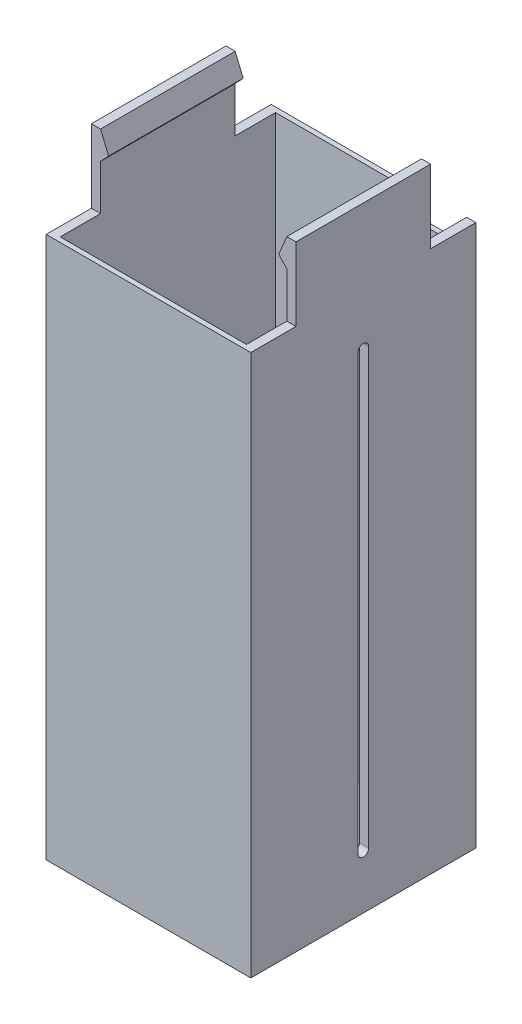
ISO-10303-21;
HEADER;
FILE_DESCRIPTION(('STEP AP214'),'2;1');
FILE_NAME('part.step','',(''),(''),'','','');
FILE_SCHEMA(('AUTOMOTIVE_DESIGN { 1 0 10303 214 1 1 1 1 }'));
ENDSEC;
DATA;
#1=APPLICATION_CONTEXT('core data for automotive mechanical design processes');
#2=APPLICATION_PROTOCOL_DEFINITION('international standard','automotive_design',2000,#1);
#3=PRODUCT_CONTEXT('',#1,'mechanical');
#4=PRODUCT('Part','Part','',(#3));
#5=PRODUCT_RELATED_PRODUCT_CATEGORY('part','',(#4));
#6=PRODUCT_DEFINITION_FORMATION('','',#4);
#7=PRODUCT_DEFINITION_CONTEXT('part definition',#1,'design');
#8=PRODUCT_DEFINITION('design','',#6,#7);
#9=PRODUCT_DEFINITION_SHAPE('','',#8);
#10=(LENGTH_UNIT() NAMED_UNIT(*) SI_UNIT(.MILLI.,.METRE.));
#11=(NAMED_UNIT(*) PLANE_ANGLE_UNIT() SI_UNIT($,.RADIAN.));
#12=(NAMED_UNIT(*) SI_UNIT($,.STERADIAN.) SOLID_ANGLE_UNIT());
#13=UNCERTAINTY_MEASURE_WITH_UNIT(LENGTH_MEASURE(1.E-05),#10,'distance_accuracy_value','');
#14=(GEOMETRIC_REPRESENTATION_CONTEXT(3) GLOBAL_UNCERTAINTY_ASSIGNED_CONTEXT((#13)) GLOBAL_UNIT_ASSIGNED_CONTEXT((#10,
#11,#12)) REPRESENTATION_CONTEXT('',''));
#15=CARTESIAN_POINT('',(0.,0.,0.));
#16=DIRECTION('',(0.,0.,1.));
#17=DIRECTION('',(1.,0.,0.));
#18=AXIS2_PLACEMENT_3D('',#15,#16,#17);
#19=CARTESIAN_POINT('',(0.,100.,0.));
#20=DIRECTION('',(0.,1.,0.));
#21=DIRECTION('',(0.,0.,1.));
#22=AXIS2_PLACEMENT_3D('',#19,#20,#21);
#23=PLANE('',#22);
#24=DIRECTION('',(-1.,0.,0.));
#25=VECTOR('',#24,1.);
#26=CARTESIAN_POINT('',(-19.,100.,-20.9));
#27=LINE('',#26,#25);
#28=CARTESIAN_POINT('',(19.,100.,-20.9));
#29=VERTEX_POINT('',#28);
#30=CARTESIAN_POINT('',(17.3,100.,-20.9));
#31=VERTEX_POINT('',#30);
#32=EDGE_CURVE('E385',#29,#31,#27,.T.);
#33=ORIENTED_EDGE('',*,*,#32,.T.);
#34=DIRECTION('',(0.,0.,-1.));
#35=VECTOR('',#34,1.);
#36=CARTESIAN_POINT('',(17.3,100.,-20.));
#37=LINE('',#36,#35);
#38=CARTESIAN_POINT('',(17.3,100.,-12.5));
#39=VERTEX_POINT('',#38);
#40=EDGE_CURVE('E354',#39,#31,#37,.T.);
#41=ORIENTED_EDGE('',*,*,#40,.F.);
#42=DIRECTION('',(-1.,0.,0.));
#43=VECTOR('',#42,1.);
#44=CARTESIAN_POINT('',(17.3,100.,-12.5));
#45=LINE('',#44,#43);
#46=CARTESIAN_POINT('',(19.,100.,-12.5));
#47=VERTEX_POINT('',#46);
#48=EDGE_CURVE('E301',#47,#39,#45,.T.);
#49=ORIENTED_EDGE('',*,*,#48,.F.);
#50=DIRECTION('',(0.,0.,-1.));
#51=VECTOR('',#50,1.);
#52=CARTESIAN_POINT('',(19.,100.,-20.9));
#53=LINE('',#52,#51);
#54=EDGE_CURVE('E380',#47,#29,#53,.T.);
#55=ORIENTED_EDGE('',*,*,#54,.T.);
#56=EDGE_LOOP('',(#33,#41,#49,#55));
#57=FACE_BOUND('',#56,.T.);
#58=ADVANCED_FACE('F35',(#57),#23,.T.);
#59=CARTESIAN_POINT('',(19.,100.,20.9));
#60=VERTEX_POINT('',#59);
#61=CARTESIAN_POINT('',(19.,100.,12.5));
#62=VERTEX_POINT('',#61);
#63=EDGE_CURVE('E381',#60,#62,#53,.T.);
#64=ORIENTED_EDGE('',*,*,#63,.T.);
#65=DIRECTION('',(1.,0.,0.));
#66=VECTOR('',#65,1.);
#67=CARTESIAN_POINT('',(17.3,100.,12.5));
#68=LINE('',#67,#66);
#69=CARTESIAN_POINT('',(17.3,100.,12.5));
#70=VERTEX_POINT('',#69);
#71=EDGE_CURVE('E287',#70,#62,#68,.T.);
#72=ORIENTED_EDGE('',*,*,#71,.F.);
#73=CARTESIAN_POINT('',(17.3,100.,20.));
#74=VERTEX_POINT('',#73);
#75=EDGE_CURVE('E355',#74,#70,#37,.T.);
#76=ORIENTED_EDGE('',*,*,#75,.F.);
#77=DIRECTION('',(1.,0.,0.));
#78=VECTOR('',#77,1.);
#79=CARTESIAN_POINT('',(17.3,100.,20.));
#80=LINE('',#79,#78);
#81=CARTESIAN_POINT('',(-17.3,100.,20.));
#82=VERTEX_POINT('',#81);
#83=EDGE_CURVE('E351',#82,#74,#80,.T.);
#84=ORIENTED_EDGE('',*,*,#83,.F.);
#85=DIRECTION('',(0.,0.,1.));
#86=VECTOR('',#85,1.);
#87=CARTESIAN_POINT('',(-17.3,100.,-20.));
#88=LINE('',#87,#86);
#89=CARTESIAN_POINT('',(-17.3,100.,12.5));
#90=VERTEX_POINT('',#89);
#91=EDGE_CURVE('E352',#90,#82,#88,.T.);
#92=ORIENTED_EDGE('',*,*,#91,.F.);
#93=DIRECTION('',(1.,0.,0.));
#94=VECTOR('',#93,1.);
#95=CARTESIAN_POINT('',(-17.3,100.,12.5));
#96=LINE('',#95,#94);
#97=CARTESIAN_POINT('',(-19.,100.,12.5));
#98=VERTEX_POINT('',#97);
#99=EDGE_CURVE('E320',#98,#90,#96,.T.);
#100=ORIENTED_EDGE('',*,*,#99,.F.);
#101=DIRECTION('',(0.,0.,1.));
#102=VECTOR('',#101,1.);
#103=CARTESIAN_POINT('',(-19.,100.,-20.9));
#104=LINE('',#103,#102);
#105=CARTESIAN_POINT('',(-19.,100.,20.9));
#106=VERTEX_POINT('',#105);
#107=EDGE_CURVE('E388',#98,#106,#104,.T.);
#108=ORIENTED_EDGE('',*,*,#107,.T.);
#109=DIRECTION('',(1.,0.,0.));
#110=VECTOR('',#109,1.);
#111=CARTESIAN_POINT('',(-19.,100.,20.9));
#112=LINE('',#111,#110);
#113=EDGE_CURVE('E391',#106,#60,#112,.T.);
#114=ORIENTED_EDGE('',*,*,#113,.T.);
#115=EDGE_LOOP('',(#64,#72,#76,#84,#92,#100,#108,#114));
#116=FACE_BOUND('',#115,.T.);
#117=ADVANCED_FACE('F431',(#116),#23,.T.);
#118=DIRECTION('',(0.,0.,-1.));
#119=VECTOR('',#118,1.);
#120=CARTESIAN_POINT('',(3.99999999999999,100.,-10.9));
#121=LINE('',#120,#119);
#122=CARTESIAN_POINT('',(3.99999999999999,100.,-20.));
#123=VERTEX_POINT('',#122);
#124=CARTESIAN_POINT('',(3.99999999999999,100.,-20.9));
#125=VERTEX_POINT('',#124);
#126=EDGE_CURVE('E249',#123,#125,#121,.T.);
#127=ORIENTED_EDGE('',*,*,#126,.T.);
#128=CARTESIAN_POINT('',(-19.,100.,-20.9));
#129=VERTEX_POINT('',#128);
#130=EDGE_CURVE('E384',#125,#129,#27,.T.);
#131=ORIENTED_EDGE('',*,*,#130,.T.);
#132=CARTESIAN_POINT('',(-19.,100.,-12.5));
#133=VERTEX_POINT('',#132);
#134=EDGE_CURVE('E389',#129,#133,#104,.T.);
#135=ORIENTED_EDGE('',*,*,#134,.T.);
#136=DIRECTION('',(-1.,0.,0.));
#137=VECTOR('',#136,1.);
#138=CARTESIAN_POINT('',(-17.3,100.,-12.5));
#139=LINE('',#138,#137);
#140=CARTESIAN_POINT('',(-17.3,100.,-12.5));
#141=VERTEX_POINT('',#140);
#142=EDGE_CURVE('E325',#141,#133,#139,.T.);
#143=ORIENTED_EDGE('',*,*,#142,.F.);
#144=CARTESIAN_POINT('',(-17.3,100.,-20.));
#145=VERTEX_POINT('',#144);
#146=EDGE_CURVE('E348',#145,#141,#88,.T.);
#147=ORIENTED_EDGE('',*,*,#146,.F.);
#148=DIRECTION('',(-1.,0.,0.));
#149=VECTOR('',#148,1.);
#150=CARTESIAN_POINT('',(17.3,100.,-20.));
#151=LINE('',#150,#149);
#152=EDGE_CURVE('E358',#123,#145,#151,.T.);
#153=ORIENTED_EDGE('',*,*,#152,.F.);
#154=EDGE_LOOP('',(#127,#131,#135,#143,#147,#153));
#155=FACE_BOUND('',#154,.T.);
#156=ADVANCED_FACE('F434',(#155),#23,.T.);
#157=CARTESIAN_POINT('',(19.,100.,-20.9));
#158=DIRECTION('',(-1.,0.,0.));
#159=DIRECTION('',(0.,0.,1.));
#160=AXIS2_PLACEMENT_3D('',#157,#158,#159);
#161=PLANE('',#160);
#162=DIRECTION('',(0.,1.,0.));
#163=VECTOR('',#162,1.);
#164=CARTESIAN_POINT('',(19.,9.4,-1.));
#165=LINE('',#164,#163);
#166=CARTESIAN_POINT('',(19.,9.40000000000001,-1.));
#167=VERTEX_POINT('',#166);
#168=CARTESIAN_POINT('',(19.,90.,-1.));
#169=VERTEX_POINT('',#168);
#170=EDGE_CURVE('E225',#167,#169,#165,.T.);
#171=ORIENTED_EDGE('',*,*,#170,.F.);
#172=CARTESIAN_POINT('',(19.,9.4,0.));
#173=DIRECTION('',(1.,0.,0.));
#174=DIRECTION('',(0.,0.,-1.));
#175=AXIS2_PLACEMENT_3D('',#172,#173,#174);
#176=CIRCLE('',#175,1.);
#177=CARTESIAN_POINT('',(19.,9.4,1.));
#178=VERTEX_POINT('',#177);
#179=EDGE_CURVE('E50',#178,#167,#176,.T.);
#180=ORIENTED_EDGE('',*,*,#179,.F.);
#181=DIRECTION('',(0.,-1.,0.));
#182=VECTOR('',#181,1.);
#183=CARTESIAN_POINT('',(19.,9.4,1.));
#184=LINE('',#183,#182);
#185=CARTESIAN_POINT('',(19.,90.,1.));
#186=VERTEX_POINT('',#185);
#187=EDGE_CURVE('E231',#186,#178,#184,.T.);
#188=ORIENTED_EDGE('',*,*,#187,.F.);
#189=CARTESIAN_POINT('',(19.,90.,0.));
#190=DIRECTION('',(1.,0.,0.));
#191=DIRECTION('',(0.,0.,-1.));
#192=AXIS2_PLACEMENT_3D('',#189,#190,#191);
#193=CIRCLE('',#192,1.);
#194=EDGE_CURVE('E216',#169,#186,#193,.T.);
#195=ORIENTED_EDGE('',*,*,#194,.F.);
#196=EDGE_LOOP('',(#171,#180,#188,#195));
#197=FACE_BOUND('',#196,.T.);
#198=DIRECTION('',(0.,-1.,0.));
#199=VECTOR('',#198,1.);
#200=CARTESIAN_POINT('',(19.,100.,20.9));
#201=LINE('',#200,#199);
#202=CARTESIAN_POINT('',(19.,-0.6,20.9));
#203=VERTEX_POINT('',#202);
#204=EDGE_CURVE('E393',#60,#203,#201,.T.);
#205=ORIENTED_EDGE('',*,*,#204,.T.);
#206=DIRECTION('',(0.,0.,1.));
#207=VECTOR('',#206,1.);
#208=CARTESIAN_POINT('',(19.,-0.6,20.9));
#209=LINE('',#208,#207);
#210=CARTESIAN_POINT('',(19.,-0.6,-20.9));
#211=VERTEX_POINT('',#210);
#212=EDGE_CURVE('E252',#211,#203,#209,.T.);
#213=ORIENTED_EDGE('',*,*,#212,.F.);
#214=DIRECTION('',(0.,-1.,0.));
#215=VECTOR('',#214,1.);
#216=CARTESIAN_POINT('',(19.,100.,-20.9));
#217=LINE('',#216,#215);
#218=EDGE_CURVE('E399',#29,#211,#217,.T.);
#219=ORIENTED_EDGE('',*,*,#218,.F.);
#220=ORIENTED_EDGE('',*,*,#54,.F.);
#221=DIRECTION('',(0.,-1.,0.));
#222=VECTOR('',#221,1.);
#223=CARTESIAN_POINT('',(19.,113.6,-12.5));
#224=LINE('',#223,#222);
#225=CARTESIAN_POINT('',(19.,113.6,-12.5));
#226=VERTEX_POINT('',#225);
#227=EDGE_CURVE('E313',#226,#47,#224,.T.);
#228=ORIENTED_EDGE('',*,*,#227,.F.);
#229=DIRECTION('',(0.,0.,-1.));
#230=VECTOR('',#229,1.);
#231=CARTESIAN_POINT('',(19.,113.6,12.5));
#232=LINE('',#231,#230);
#233=CARTESIAN_POINT('',(19.,113.6,12.5));
#234=VERTEX_POINT('',#233);
#235=EDGE_CURVE('E303',#234,#226,#232,.T.);
#236=ORIENTED_EDGE('',*,*,#235,.F.);
#237=DIRECTION('',(0.,-1.,0.));
#238=VECTOR('',#237,1.);
#239=CARTESIAN_POINT('',(19.,113.6,12.5));
#240=LINE('',#239,#238);
#241=EDGE_CURVE('E315',#234,#62,#240,.T.);
#242=ORIENTED_EDGE('',*,*,#241,.T.);
#243=ORIENTED_EDGE('',*,*,#63,.F.);
#244=EDGE_LOOP('',(#205,#213,#219,#220,#228,#236,#242,#243));
#245=FACE_BOUND('',#244,.T.);
#246=ADVANCED_FACE('F37',(#197,#245),#161,.F.);
#247=CARTESIAN_POINT('',(-19.,100.,-20.9));
#248=DIRECTION('',(0.,0.,1.));
#249=DIRECTION('',(1.,0.,0.));
#250=AXIS2_PLACEMENT_3D('',#247,#248,#249);
#251=PLANE('',#250);
#252=DIRECTION('',(-1.,0.,0.));
#253=VECTOR('',#252,1.);
#254=CARTESIAN_POINT('',(17.3,95.6,-20.9));
#255=LINE('',#254,#253);
#256=CARTESIAN_POINT('',(17.3,95.6,-20.9));
#257=VERTEX_POINT('',#256);
#258=CARTESIAN_POINT('',(3.99999999999998,95.6,-20.9));
#259=VERTEX_POINT('',#258);
#260=EDGE_CURVE('E243',#257,#259,#255,.T.);
#261=ORIENTED_EDGE('',*,*,#260,.F.);
#262=DIRECTION('',(0.,-1.,0.));
#263=VECTOR('',#262,1.);
#264=CARTESIAN_POINT('',(17.3,100.,-20.9));
#265=LINE('',#264,#263);
#266=EDGE_CURVE('E238',#31,#257,#265,.T.);
#267=ORIENTED_EDGE('',*,*,#266,.F.);
#268=ORIENTED_EDGE('',*,*,#32,.F.);
#269=ORIENTED_EDGE('',*,*,#218,.T.);
#270=DIRECTION('',(1.,0.,0.));
#271=VECTOR('',#270,1.);
#272=CARTESIAN_POINT('',(19.,-0.6,-20.9));
#273=LINE('',#272,#271);
#274=CARTESIAN_POINT('',(-19.,-0.6,-20.9));
#275=VERTEX_POINT('',#274);
#276=EDGE_CURVE('E264',#275,#211,#273,.T.);
#277=ORIENTED_EDGE('',*,*,#276,.F.);
#278=DIRECTION('',(0.,-1.,0.));
#279=VECTOR('',#278,1.);
#280=CARTESIAN_POINT('',(-19.,100.,-20.9));
#281=LINE('',#280,#279);
#282=EDGE_CURVE('E397',#129,#275,#281,.T.);
#283=ORIENTED_EDGE('',*,*,#282,.F.);
#284=ORIENTED_EDGE('',*,*,#130,.F.);
#285=DIRECTION('',(0.,1.,0.));
#286=VECTOR('',#285,1.);
#287=CARTESIAN_POINT('',(3.99999999999999,100.,-20.9));
#288=LINE('',#287,#286);
#289=EDGE_CURVE('E246',#259,#125,#288,.T.);
#290=ORIENTED_EDGE('',*,*,#289,.F.);
#291=EDGE_LOOP('',(#261,#267,#268,#269,#277,#283,#284,#290));
#292=FACE_BOUND('',#291,.T.);
#293=ADVANCED_FACE('F446',(#292),#251,.F.);
#294=CARTESIAN_POINT('',(-19.,100.,-20.9));
#295=DIRECTION('',(1.,0.,0.));
#296=DIRECTION('',(0.,0.,-1.));
#297=AXIS2_PLACEMENT_3D('',#294,#295,#296);
#298=PLANE('',#297);
#299=ORIENTED_EDGE('',*,*,#282,.T.);
#300=DIRECTION('',(0.,0.,-1.));
#301=VECTOR('',#300,1.);
#302=CARTESIAN_POINT('',(-19.,-0.6,20.9));
#303=LINE('',#302,#301);
#304=CARTESIAN_POINT('',(-19.,-0.6,20.9));
#305=VERTEX_POINT('',#304);
#306=EDGE_CURVE('E261',#305,#275,#303,.T.);
#307=ORIENTED_EDGE('',*,*,#306,.F.);
#308=DIRECTION('',(0.,-1.,0.));
#309=VECTOR('',#308,1.);
#310=CARTESIAN_POINT('',(-19.,100.,20.9));
#311=LINE('',#310,#309);
#312=EDGE_CURVE('E395',#106,#305,#311,.T.);
#313=ORIENTED_EDGE('',*,*,#312,.F.);
#314=ORIENTED_EDGE('',*,*,#107,.F.);
#315=DIRECTION('',(0.,-1.,0.));
#316=VECTOR('',#315,1.);
#317=CARTESIAN_POINT('',(-19.,113.6,12.5));
#318=LINE('',#317,#316);
#319=CARTESIAN_POINT('',(-19.,113.6,12.5));
#320=VERTEX_POINT('',#319);
#321=EDGE_CURVE('E344',#320,#98,#318,.T.);
#322=ORIENTED_EDGE('',*,*,#321,.F.);
#323=DIRECTION('',(0.,0.,1.));
#324=VECTOR('',#323,1.);
#325=CARTESIAN_POINT('',(-19.,113.6,12.5));
#326=LINE('',#325,#324);
#327=CARTESIAN_POINT('',(-19.,113.6,-12.5));
#328=VERTEX_POINT('',#327);
#329=EDGE_CURVE('E321',#328,#320,#326,.T.);
#330=ORIENTED_EDGE('',*,*,#329,.F.);
#331=DIRECTION('',(0.,-1.,0.));
#332=VECTOR('',#331,1.);
#333=CARTESIAN_POINT('',(-19.,113.6,-12.5));
#334=LINE('',#333,#332);
#335=EDGE_CURVE('E333',#328,#133,#334,.T.);
#336=ORIENTED_EDGE('',*,*,#335,.T.);
#337=ORIENTED_EDGE('',*,*,#134,.F.);
#338=EDGE_LOOP('',(#299,#307,#313,#314,#322,#330,#336,#337));
#339=FACE_BOUND('',#338,.T.);
#340=ADVANCED_FACE('F460',(#339),#298,.F.);
#341=CARTESIAN_POINT('',(-19.,100.,20.9));
#342=DIRECTION('',(0.,0.,-1.));
#343=DIRECTION('',(-1.,0.,0.));
#344=AXIS2_PLACEMENT_3D('',#341,#342,#343);
#345=PLANE('',#344);
#346=ORIENTED_EDGE('',*,*,#312,.T.);
#347=DIRECTION('',(-1.,0.,0.));
#348=VECTOR('',#347,1.);
#349=CARTESIAN_POINT('',(19.,-0.6,20.9));
#350=LINE('',#349,#348);
#351=EDGE_CURVE('E258',#203,#305,#350,.T.);
#352=ORIENTED_EDGE('',*,*,#351,.F.);
#353=ORIENTED_EDGE('',*,*,#204,.F.);
#354=ORIENTED_EDGE('',*,*,#113,.F.);
#355=EDGE_LOOP('',(#346,#352,#353,#354));
#356=FACE_BOUND('',#355,.T.);
#357=ADVANCED_FACE('F500',(#356),#345,.F.);
#358=CARTESIAN_POINT('',(-17.3,100.,-20.));
#359=DIRECTION('',(1.,0.,0.));
#360=DIRECTION('',(0.,0.,-1.));
#361=AXIS2_PLACEMENT_3D('',#358,#359,#360);
#362=PLANE('',#361);
#363=DIRECTION('',(0.,0.,1.));
#364=VECTOR('',#363,1.);
#365=CARTESIAN_POINT('',(-17.3,108.4,-17.9120236510939));
#366=LINE('',#365,#364);
#367=CARTESIAN_POINT('',(-17.3,108.4,-12.5));
#368=VERTEX_POINT('',#367);
#369=CARTESIAN_POINT('',(-17.3,108.4,12.5));
#370=VERTEX_POINT('',#369);
#371=EDGE_CURVE('E293',#368,#370,#366,.T.);
#372=ORIENTED_EDGE('',*,*,#371,.T.);
#373=DIRECTION('',(0.,-1.,0.));
#374=VECTOR('',#373,1.);
#375=CARTESIAN_POINT('',(-17.3,113.6,12.5));
#376=LINE('',#375,#374);
#377=EDGE_CURVE('E342',#370,#90,#376,.T.);
#378=ORIENTED_EDGE('',*,*,#377,.T.);
#379=ORIENTED_EDGE('',*,*,#91,.T.);
#380=DIRECTION('',(0.,-1.,0.));
#381=VECTOR('',#380,1.);
#382=CARTESIAN_POINT('',(-17.3,100.,20.));
#383=LINE('',#382,#381);
#384=CARTESIAN_POINT('',(-17.3,0.,20.));
#385=VERTEX_POINT('',#384);
#386=EDGE_CURVE('E377',#82,#385,#383,.T.);
#387=ORIENTED_EDGE('',*,*,#386,.T.);
#388=DIRECTION('',(0.,0.,1.));
#389=VECTOR('',#388,1.);
#390=CARTESIAN_POINT('',(-17.3,0.,-20.));
#391=LINE('',#390,#389);
#392=CARTESIAN_POINT('',(-17.3,0.,-20.));
#393=VERTEX_POINT('',#392);
#394=EDGE_CURVE('E347',#393,#385,#391,.T.);
#395=ORIENTED_EDGE('',*,*,#394,.F.);
#396=DIRECTION('',(0.,-1.,0.));
#397=VECTOR('',#396,1.);
#398=CARTESIAN_POINT('',(-17.3,100.,-20.));
#399=LINE('',#398,#397);
#400=EDGE_CURVE('E360',#145,#393,#399,.T.);
#401=ORIENTED_EDGE('',*,*,#400,.F.);
#402=ORIENTED_EDGE('',*,*,#146,.T.);
#403=DIRECTION('',(0.,-1.,0.));
#404=VECTOR('',#403,1.);
#405=CARTESIAN_POINT('',(-17.3,113.6,-12.5));
#406=LINE('',#405,#404);
#407=EDGE_CURVE('E340',#368,#141,#406,.T.);
#408=ORIENTED_EDGE('',*,*,#407,.F.);
#409=EDGE_LOOP('',(#372,#378,#379,#387,#395,#401,#402,#408));
#410=FACE_BOUND('',#409,.T.);
#411=ADVANCED_FACE('F471',(#410),#362,.T.);
#412=CARTESIAN_POINT('',(17.3,100.,20.));
#413=DIRECTION('',(0.,0.,-1.));
#414=DIRECTION('',(-1.,0.,0.));
#415=AXIS2_PLACEMENT_3D('',#412,#413,#414);
#416=PLANE('',#415);
#417=DIRECTION('',(1.,0.,0.));
#418=VECTOR('',#417,1.);
#419=CARTESIAN_POINT('',(17.3,0.,20.));
#420=LINE('',#419,#418);
#421=CARTESIAN_POINT('',(17.3,0.,20.));
#422=VERTEX_POINT('',#421);
#423=EDGE_CURVE('E363',#385,#422,#420,.T.);
#424=ORIENTED_EDGE('',*,*,#423,.F.);
#425=ORIENTED_EDGE('',*,*,#386,.F.);
#426=ORIENTED_EDGE('',*,*,#83,.T.);
#427=DIRECTION('',(0.,-1.,0.));
#428=VECTOR('',#427,1.);
#429=CARTESIAN_POINT('',(17.3,100.,20.));
#430=LINE('',#429,#428);
#431=EDGE_CURVE('E375',#74,#422,#430,.T.);
#432=ORIENTED_EDGE('',*,*,#431,.T.);
#433=EDGE_LOOP('',(#424,#425,#426,#432));
#434=FACE_BOUND('',#433,.T.);
#435=ADVANCED_FACE('F546',(#434),#416,.T.);
#436=CARTESIAN_POINT('',(17.3,100.,-20.));
#437=DIRECTION('',(-1.,0.,0.));
#438=DIRECTION('',(0.,0.,1.));
#439=AXIS2_PLACEMENT_3D('',#436,#437,#438);
#440=PLANE('',#439);
#441=CARTESIAN_POINT('',(17.3,9.4,0.));
#442=DIRECTION('',(-1.,0.,0.));
#443=DIRECTION('',(0.,0.,1.));
#444=AXIS2_PLACEMENT_3D('',#441,#442,#443);
#445=CIRCLE('',#444,1.);
#446=CARTESIAN_POINT('',(17.3,9.4,-1.));
#447=VERTEX_POINT('',#446);
#448=CARTESIAN_POINT('',(17.3,9.4,1.));
#449=VERTEX_POINT('',#448);
#450=EDGE_CURVE('E11',#447,#449,#445,.T.);
#451=ORIENTED_EDGE('',*,*,#450,.F.);
#452=DIRECTION('',(0.,-1.,0.));
#453=VECTOR('',#452,1.);
#454=CARTESIAN_POINT('',(17.3,100.,-1.));
#455=LINE('',#454,#453);
#456=CARTESIAN_POINT('',(17.3,90.,-1.));
#457=VERTEX_POINT('',#456);
#458=EDGE_CURVE('E406',#457,#447,#455,.T.);
#459=ORIENTED_EDGE('',*,*,#458,.F.);
#460=CARTESIAN_POINT('',(17.3,90.,0.));
#461=DIRECTION('',(-1.,0.,0.));
#462=DIRECTION('',(0.,0.,1.));
#463=AXIS2_PLACEMENT_3D('',#460,#461,#462);
#464=CIRCLE('',#463,1.);
#465=CARTESIAN_POINT('',(17.3,90.,1.));
#466=VERTEX_POINT('',#465);
#467=EDGE_CURVE('E219',#466,#457,#464,.T.);
#468=ORIENTED_EDGE('',*,*,#467,.F.);
#469=DIRECTION('',(0.,1.,0.));
#470=VECTOR('',#469,1.);
#471=CARTESIAN_POINT('',(17.3,100.,1.));
#472=LINE('',#471,#470);
#473=EDGE_CURVE('E43',#449,#466,#472,.T.);
#474=ORIENTED_EDGE('',*,*,#473,.F.);
#475=EDGE_LOOP('',(#451,#459,#468,#474));
#476=FACE_BOUND('',#475,.T.);
#477=DIRECTION('',(0.,-1.,0.));
#478=VECTOR('',#477,1.);
#479=CARTESIAN_POINT('',(17.3,113.6,-12.5));
#480=LINE('',#479,#478);
#481=CARTESIAN_POINT('',(17.3,108.4,-12.5));
#482=VERTEX_POINT('',#481);
#483=EDGE_CURVE('E308',#482,#39,#480,.T.);
#484=ORIENTED_EDGE('',*,*,#483,.T.);
#485=ORIENTED_EDGE('',*,*,#40,.T.);
#486=ORIENTED_EDGE('',*,*,#266,.T.);
#487=DIRECTION('',(0.,0.,-1.));
#488=VECTOR('',#487,1.);
#489=CARTESIAN_POINT('',(17.3,95.6,-10.9));
#490=LINE('',#489,#488);
#491=CARTESIAN_POINT('',(17.3,95.6,-20.));
#492=VERTEX_POINT('',#491);
#493=EDGE_CURVE('E248',#492,#257,#490,.T.);
#494=ORIENTED_EDGE('',*,*,#493,.F.);
#495=DIRECTION('',(0.,-1.,0.));
#496=VECTOR('',#495,1.);
#497=CARTESIAN_POINT('',(17.3,100.,-20.));
#498=LINE('',#497,#496);
#499=CARTESIAN_POINT('',(17.3,0.,-20.));
#500=VERTEX_POINT('',#499);
#501=EDGE_CURVE('E373',#492,#500,#498,.T.);
#502=ORIENTED_EDGE('',*,*,#501,.T.);
#503=DIRECTION('',(0.,0.,-1.));
#504=VECTOR('',#503,1.);
#505=CARTESIAN_POINT('',(17.3,0.,-20.));
#506=LINE('',#505,#504);
#507=EDGE_CURVE('E366',#422,#500,#506,.T.);
#508=ORIENTED_EDGE('',*,*,#507,.F.);
#509=ORIENTED_EDGE('',*,*,#431,.F.);
#510=ORIENTED_EDGE('',*,*,#75,.T.);
#511=DIRECTION('',(0.,-1.,0.));
#512=VECTOR('',#511,1.);
#513=CARTESIAN_POINT('',(17.3,113.6,12.5));
#514=LINE('',#513,#512);
#515=CARTESIAN_POINT('',(17.3,108.4,12.5));
#516=VERTEX_POINT('',#515);
#517=EDGE_CURVE('E318',#516,#70,#514,.T.);
#518=ORIENTED_EDGE('',*,*,#517,.F.);
#519=DIRECTION('',(0.,0.,1.));
#520=VECTOR('',#519,1.);
#521=CARTESIAN_POINT('',(17.3,108.4,-17.9120236510939));
#522=LINE('',#521,#520);
#523=EDGE_CURVE('E271',#482,#516,#522,.T.);
#524=ORIENTED_EDGE('',*,*,#523,.F.);
#525=EDGE_LOOP('',(#484,#485,#486,#494,#502,#508,#509,#510,#518,#524));
#526=FACE_BOUND('',#525,.T.);
#527=ADVANCED_FACE('F414',(#476,#526),#440,.T.);
#528=CARTESIAN_POINT('',(17.3,100.,-20.));
#529=DIRECTION('',(0.,0.,1.));
#530=DIRECTION('',(1.,0.,0.));
#531=AXIS2_PLACEMENT_3D('',#528,#529,#530);
#532=PLANE('',#531);
#533=DIRECTION('',(0.,-1.,0.));
#534=VECTOR('',#533,1.);
#535=CARTESIAN_POINT('',(3.99999999999999,100.,-20.));
#536=LINE('',#535,#534);
#537=CARTESIAN_POINT('',(3.99999999999998,95.6,-20.));
#538=VERTEX_POINT('',#537);
#539=EDGE_CURVE('E403',#123,#538,#536,.T.);
#540=ORIENTED_EDGE('',*,*,#539,.F.);
#541=ORIENTED_EDGE('',*,*,#152,.T.);
#542=ORIENTED_EDGE('',*,*,#400,.T.);
#543=DIRECTION('',(-1.,0.,0.));
#544=VECTOR('',#543,1.);
#545=CARTESIAN_POINT('',(17.3,0.,-20.));
#546=LINE('',#545,#544);
#547=EDGE_CURVE('E369',#500,#393,#546,.T.);
#548=ORIENTED_EDGE('',*,*,#547,.F.);
#549=ORIENTED_EDGE('',*,*,#501,.F.);
#550=DIRECTION('',(1.,0.,0.));
#551=VECTOR('',#550,1.);
#552=CARTESIAN_POINT('',(17.3,95.6,-20.));
#553=LINE('',#552,#551);
#554=EDGE_CURVE('E401',#538,#492,#553,.T.);
#555=ORIENTED_EDGE('',*,*,#554,.F.);
#556=EDGE_LOOP('',(#540,#541,#542,#548,#549,#555));
#557=FACE_BOUND('',#556,.T.);
#558=ADVANCED_FACE('F477',(#557),#532,.T.);
#559=CARTESIAN_POINT('',(-17.3,113.6,12.5));
#560=DIRECTION('',(0.,0.,-1.));
#561=DIRECTION('',(-1.,0.,0.));
#562=AXIS2_PLACEMENT_3D('',#559,#560,#561);
#563=PLANE('',#562);
#564=ORIENTED_EDGE('',*,*,#99,.T.);
#565=ORIENTED_EDGE('',*,*,#377,.F.);
#566=DIRECTION('',(0.683941128881329,0.729537204140086,0.));
#567=VECTOR('',#566,1.);
#568=CARTESIAN_POINT('',(-15.8,110.,12.5));
#569=LINE('',#568,#567);
#570=CARTESIAN_POINT('',(-15.8,110.,12.5));
#571=VERTEX_POINT('',#570);
#572=EDGE_CURVE('E290',#370,#571,#569,.T.);
#573=ORIENTED_EDGE('',*,*,#572,.T.);
#574=DIRECTION('',(-0.384615384615384,0.923076923076923,0.));
#575=VECTOR('',#574,1.);
#576=CARTESIAN_POINT('',(-17.3,113.6,12.5));
#577=LINE('',#576,#575);
#578=CARTESIAN_POINT('',(-17.3,113.6,12.5));
#579=VERTEX_POINT('',#578);
#580=EDGE_CURVE('E281',#571,#579,#577,.T.);
#581=ORIENTED_EDGE('',*,*,#580,.T.);
#582=DIRECTION('',(1.,0.,0.));
#583=VECTOR('',#582,1.);
#584=CARTESIAN_POINT('',(-17.3,113.6,12.5));
#585=LINE('',#584,#583);
#586=EDGE_CURVE('E324',#320,#579,#585,.T.);
#587=ORIENTED_EDGE('',*,*,#586,.F.);
#588=ORIENTED_EDGE('',*,*,#321,.T.);
#589=EDGE_LOOP('',(#564,#565,#573,#581,#587,#588));
#590=FACE_BOUND('',#589,.T.);
#591=ADVANCED_FACE('F506',(#590),#563,.F.);
#592=CARTESIAN_POINT('',(-17.3,113.6,-12.5));
#593=DIRECTION('',(0.,0.,1.));
#594=DIRECTION('',(1.,0.,0.));
#595=AXIS2_PLACEMENT_3D('',#592,#593,#594);
#596=PLANE('',#595);
#597=ORIENTED_EDGE('',*,*,#142,.T.);
#598=ORIENTED_EDGE('',*,*,#335,.F.);
#599=DIRECTION('',(-1.,0.,0.));
#600=VECTOR('',#599,1.);
#601=CARTESIAN_POINT('',(-17.3,113.6,-12.5));
#602=LINE('',#601,#600);
#603=CARTESIAN_POINT('',(-17.3,113.6,-12.5));
#604=VERTEX_POINT('',#603);
#605=EDGE_CURVE('E331',#604,#328,#602,.T.);
#606=ORIENTED_EDGE('',*,*,#605,.F.);
#607=DIRECTION('',(0.384615384615384,-0.923076923076923,0.));
#608=VECTOR('',#607,1.);
#609=CARTESIAN_POINT('',(-17.3,113.6,-12.5));
#610=LINE('',#609,#608);
#611=CARTESIAN_POINT('',(-15.8,110.,-12.5));
#612=VERTEX_POINT('',#611);
#613=EDGE_CURVE('E284',#604,#612,#610,.T.);
#614=ORIENTED_EDGE('',*,*,#613,.T.);
#615=DIRECTION('',(-0.683941128881329,-0.729537204140086,0.));
#616=VECTOR('',#615,1.);
#617=CARTESIAN_POINT('',(-15.8,110.,-12.5));
#618=LINE('',#617,#616);
#619=EDGE_CURVE('E282',#612,#368,#618,.T.);
#620=ORIENTED_EDGE('',*,*,#619,.T.);
#621=ORIENTED_EDGE('',*,*,#407,.T.);
#622=EDGE_LOOP('',(#597,#598,#606,#614,#620,#621));
#623=FACE_BOUND('',#622,.T.);
#624=ADVANCED_FACE('F465',(#623),#596,.F.);
#625=CARTESIAN_POINT('',(0.,113.6,0.));
#626=DIRECTION('',(0.,1.,0.));
#627=DIRECTION('',(0.,0.,1.));
#628=AXIS2_PLACEMENT_3D('',#625,#626,#627);
#629=PLANE('',#628);
#630=ORIENTED_EDGE('',*,*,#329,.T.);
#631=ORIENTED_EDGE('',*,*,#586,.T.);
#632=DIRECTION('',(0.,0.,-1.));
#633=VECTOR('',#632,1.);
#634=CARTESIAN_POINT('',(-17.3,113.6,12.5));
#635=LINE('',#634,#633);
#636=EDGE_CURVE('E328',#579,#604,#635,.T.);
#637=ORIENTED_EDGE('',*,*,#636,.T.);
#638=ORIENTED_EDGE('',*,*,#605,.T.);
#639=EDGE_LOOP('',(#630,#631,#637,#638));
#640=FACE_BOUND('',#639,.T.);
#641=ADVANCED_FACE('F508',(#640),#629,.T.);
#642=CARTESIAN_POINT('',(17.3,113.6,12.5));
#643=DIRECTION('',(0.,0.,-1.));
#644=DIRECTION('',(-1.,0.,0.));
#645=AXIS2_PLACEMENT_3D('',#642,#643,#644);
#646=PLANE('',#645);
#647=ORIENTED_EDGE('',*,*,#71,.T.);
#648=ORIENTED_EDGE('',*,*,#241,.F.);
#649=DIRECTION('',(1.,0.,0.));
#650=VECTOR('',#649,1.);
#651=CARTESIAN_POINT('',(17.3,113.6,12.5));
#652=LINE('',#651,#650);
#653=CARTESIAN_POINT('',(17.3,113.6,12.5));
#654=VERTEX_POINT('',#653);
#655=EDGE_CURVE('E300',#654,#234,#652,.T.);
#656=ORIENTED_EDGE('',*,*,#655,.F.);
#657=DIRECTION('',(-0.384615384615385,-0.923076923076923,0.));
#658=VECTOR('',#657,1.);
#659=CARTESIAN_POINT('',(17.3,113.6,12.5));
#660=LINE('',#659,#658);
#661=CARTESIAN_POINT('',(15.8,110.,12.5));
#662=VERTEX_POINT('',#661);
#663=EDGE_CURVE('E267',#654,#662,#660,.T.);
#664=ORIENTED_EDGE('',*,*,#663,.T.);
#665=DIRECTION('',(0.683941128881329,-0.729537204140086,0.));
#666=VECTOR('',#665,1.);
#667=CARTESIAN_POINT('',(15.8,110.,12.5));
#668=LINE('',#667,#666);
#669=EDGE_CURVE('E274',#662,#516,#668,.T.);
#670=ORIENTED_EDGE('',*,*,#669,.T.);
#671=ORIENTED_EDGE('',*,*,#517,.T.);
#672=EDGE_LOOP('',(#647,#648,#656,#664,#670,#671));
#673=FACE_BOUND('',#672,.T.);
#674=ADVANCED_FACE('F531',(#673),#646,.F.);
#675=CARTESIAN_POINT('',(17.3,113.6,-12.5));
#676=DIRECTION('',(0.,0.,1.));
#677=DIRECTION('',(1.,0.,0.));
#678=AXIS2_PLACEMENT_3D('',#675,#676,#677);
#679=PLANE('',#678);
#680=ORIENTED_EDGE('',*,*,#48,.T.);
#681=ORIENTED_EDGE('',*,*,#483,.F.);
#682=DIRECTION('',(-0.683941128881329,0.729537204140086,0.));
#683=VECTOR('',#682,1.);
#684=CARTESIAN_POINT('',(15.8,110.,-12.5));
#685=LINE('',#684,#683);
#686=CARTESIAN_POINT('',(15.8,110.,-12.5));
#687=VERTEX_POINT('',#686);
#688=EDGE_CURVE('E270',#482,#687,#685,.T.);
#689=ORIENTED_EDGE('',*,*,#688,.T.);
#690=DIRECTION('',(0.384615384615385,0.923076923076923,0.));
#691=VECTOR('',#690,1.);
#692=CARTESIAN_POINT('',(17.3,113.6,-12.5));
#693=LINE('',#692,#691);
#694=CARTESIAN_POINT('',(17.3,113.6,-12.5));
#695=VERTEX_POINT('',#694);
#696=EDGE_CURVE('E268',#687,#695,#693,.T.);
#697=ORIENTED_EDGE('',*,*,#696,.T.);
#698=DIRECTION('',(-1.,0.,0.));
#699=VECTOR('',#698,1.);
#700=CARTESIAN_POINT('',(17.3,113.6,-12.5));
#701=LINE('',#700,#699);
#702=EDGE_CURVE('E305',#226,#695,#701,.T.);
#703=ORIENTED_EDGE('',*,*,#702,.F.);
#704=ORIENTED_EDGE('',*,*,#227,.T.);
#705=EDGE_LOOP('',(#680,#681,#689,#697,#703,#704));
#706=FACE_BOUND('',#705,.T.);
#707=ADVANCED_FACE('F524',(#706),#679,.F.);
#708=CARTESIAN_POINT('',(0.,113.6,0.));
#709=DIRECTION('',(0.,-1.,0.));
#710=DIRECTION('',(0.,0.,-1.));
#711=AXIS2_PLACEMENT_3D('',#708,#709,#710);
#712=PLANE('',#711);
#713=DIRECTION('',(0.,0.,1.));
#714=VECTOR('',#713,1.);
#715=CARTESIAN_POINT('',(17.3,113.6,12.5));
#716=LINE('',#715,#714);
#717=EDGE_CURVE('E297',#695,#654,#716,.T.);
#718=ORIENTED_EDGE('',*,*,#717,.T.);
#719=ORIENTED_EDGE('',*,*,#655,.T.);
#720=ORIENTED_EDGE('',*,*,#235,.T.);
#721=ORIENTED_EDGE('',*,*,#702,.T.);
#722=EDGE_LOOP('',(#718,#719,#720,#721));
#723=FACE_BOUND('',#722,.T.);
#724=ADVANCED_FACE('F516',(#723),#712,.F.);
#725=CARTESIAN_POINT('',(-17.3,113.6,-17.9120236510939));
#726=DIRECTION('',(0.923076923076923,0.384615384615384,0.));
#727=DIRECTION('',(-0.384615384615384,0.923076923076923,0.));
#728=AXIS2_PLACEMENT_3D('',#725,#726,#727);
#729=PLANE('',#728);
#730=ORIENTED_EDGE('',*,*,#613,.F.);
#731=ORIENTED_EDGE('',*,*,#636,.F.);
#732=ORIENTED_EDGE('',*,*,#580,.F.);
#733=DIRECTION('',(0.,0.,1.));
#734=VECTOR('',#733,1.);
#735=CARTESIAN_POINT('',(-15.8,110.,-17.9120236510939));
#736=LINE('',#735,#734);
#737=EDGE_CURVE('E285',#612,#571,#736,.T.);
#738=ORIENTED_EDGE('',*,*,#737,.F.);
#739=EDGE_LOOP('',(#730,#731,#732,#738));
#740=FACE_BOUND('',#739,.T.);
#741=ADVANCED_FACE('F514',(#740),#729,.T.);
#742=CARTESIAN_POINT('',(-15.8,110.,-17.9120236510939));
#743=DIRECTION('',(0.729537204140086,-0.683941128881329,0.));
#744=DIRECTION('',(0.683941128881329,0.729537204140086,0.));
#745=AXIS2_PLACEMENT_3D('',#742,#743,#744);
#746=PLANE('',#745);
#747=ORIENTED_EDGE('',*,*,#619,.F.);
#748=ORIENTED_EDGE('',*,*,#737,.T.);
#749=ORIENTED_EDGE('',*,*,#572,.F.);
#750=ORIENTED_EDGE('',*,*,#371,.F.);
#751=EDGE_LOOP('',(#747,#748,#749,#750));
#752=FACE_BOUND('',#751,.T.);
#753=ADVANCED_FACE('F512',(#752),#746,.T.);
#754=CARTESIAN_POINT('',(17.3,113.6,-17.9120236510939));
#755=DIRECTION('',(-0.923076923076923,0.384615384615385,0.));
#756=DIRECTION('',(-0.384615384615385,-0.923076923076923,0.));
#757=AXIS2_PLACEMENT_3D('',#754,#755,#756);
#758=PLANE('',#757);
#759=ORIENTED_EDGE('',*,*,#696,.F.);
#760=DIRECTION('',(0.,0.,1.));
#761=VECTOR('',#760,1.);
#762=CARTESIAN_POINT('',(15.8,110.,-17.9120236510939));
#763=LINE('',#762,#761);
#764=EDGE_CURVE('E277',#687,#662,#763,.T.);
#765=ORIENTED_EDGE('',*,*,#764,.T.);
#766=ORIENTED_EDGE('',*,*,#663,.F.);
#767=ORIENTED_EDGE('',*,*,#717,.F.);
#768=EDGE_LOOP('',(#759,#765,#766,#767));
#769=FACE_BOUND('',#768,.T.);
#770=ADVANCED_FACE('F522',(#769),#758,.T.);
#771=CARTESIAN_POINT('',(15.8,110.,-17.9120236510939));
#772=DIRECTION('',(-0.729537204140086,-0.683941128881329,0.));
#773=DIRECTION('',(0.683941128881329,-0.729537204140086,0.));
#774=AXIS2_PLACEMENT_3D('',#771,#772,#773);
#775=PLANE('',#774);
#776=ORIENTED_EDGE('',*,*,#688,.F.);
#777=ORIENTED_EDGE('',*,*,#523,.T.);
#778=ORIENTED_EDGE('',*,*,#669,.F.);
#779=ORIENTED_EDGE('',*,*,#764,.F.);
#780=EDGE_LOOP('',(#776,#777,#778,#779));
#781=FACE_BOUND('',#780,.T.);
#782=ADVANCED_FACE('F574',(#781),#775,.T.);
#783=CARTESIAN_POINT('',(0.,0.,0.));
#784=DIRECTION('',(0.,1.,0.));
#785=DIRECTION('',(0.,0.,1.));
#786=AXIS2_PLACEMENT_3D('',#783,#784,#785);
#787=PLANE('',#786);
#788=ORIENTED_EDGE('',*,*,#547,.T.);
#789=ORIENTED_EDGE('',*,*,#394,.T.);
#790=ORIENTED_EDGE('',*,*,#423,.T.);
#791=ORIENTED_EDGE('',*,*,#507,.T.);
#792=EDGE_LOOP('',(#788,#789,#790,#791));
#793=FACE_BOUND('',#792,.T.);
#794=ADVANCED_FACE('F598',(#793),#787,.T.);
#795=CARTESIAN_POINT('',(0.,-0.6,0.));
#796=DIRECTION('',(0.,1.,0.));
#797=DIRECTION('',(0.,0.,1.));
#798=AXIS2_PLACEMENT_3D('',#795,#796,#797);
#799=PLANE('',#798);
#800=ORIENTED_EDGE('',*,*,#212,.T.);
#801=ORIENTED_EDGE('',*,*,#351,.T.);
#802=ORIENTED_EDGE('',*,*,#306,.T.);
#803=ORIENTED_EDGE('',*,*,#276,.T.);
#804=EDGE_LOOP('',(#800,#801,#802,#803));
#805=FACE_BOUND('',#804,.T.);
#806=ADVANCED_FACE('F492',(#805),#799,.F.);
#807=CARTESIAN_POINT('',(3.99999999999999,100.,-10.9));
#808=DIRECTION('',(-1.,0.,0.));
#809=DIRECTION('',(0.,-1.,0.));
#810=AXIS2_PLACEMENT_3D('',#807,#808,#809);
#811=PLANE('',#810);
#812=ORIENTED_EDGE('',*,*,#539,.T.);
#813=DIRECTION('',(0.,0.,-1.));
#814=VECTOR('',#813,1.);
#815=CARTESIAN_POINT('',(3.99999999999998,95.6,-10.9));
#816=LINE('',#815,#814);
#817=EDGE_CURVE('E253',#538,#259,#816,.T.);
#818=ORIENTED_EDGE('',*,*,#817,.T.);
#819=ORIENTED_EDGE('',*,*,#289,.T.);
#820=ORIENTED_EDGE('',*,*,#126,.F.);
#821=EDGE_LOOP('',(#812,#818,#819,#820));
#822=FACE_BOUND('',#821,.T.);
#823=ADVANCED_FACE('F425',(#822),#811,.F.);
#824=CARTESIAN_POINT('',(17.3,95.6,-10.9));
#825=DIRECTION('',(0.,-1.,0.));
#826=DIRECTION('',(0.,0.,-1.));
#827=AXIS2_PLACEMENT_3D('',#824,#825,#826);
#828=PLANE('',#827);
#829=ORIENTED_EDGE('',*,*,#554,.T.);
#830=ORIENTED_EDGE('',*,*,#493,.T.);
#831=ORIENTED_EDGE('',*,*,#260,.T.);
#832=ORIENTED_EDGE('',*,*,#817,.F.);
#833=EDGE_LOOP('',(#829,#830,#831,#832));
#834=FACE_BOUND('',#833,.T.);
#835=ADVANCED_FACE('F418',(#834),#828,.F.);
#836=CARTESIAN_POINT('',(8.99999999999999,9.4,0.));
#837=DIRECTION('',(1.,0.,0.));
#838=DIRECTION('',(0.,0.,-1.));
#839=AXIS2_PLACEMENT_3D('',#836,#837,#838);
#840=CYLINDRICAL_SURFACE('',#839,1.);
#841=ORIENTED_EDGE('',*,*,#450,.T.);
#842=DIRECTION('',(1.,0.,0.));
#843=VECTOR('',#842,1.);
#844=CARTESIAN_POINT('',(8.99999999999999,9.4,1.));
#845=LINE('',#844,#843);
#846=EDGE_CURVE('E236',#449,#178,#845,.T.);
#847=ORIENTED_EDGE('',*,*,#846,.T.);
#848=ORIENTED_EDGE('',*,*,#179,.T.);
#849=DIRECTION('',(1.,0.,0.));
#850=VECTOR('',#849,1.);
#851=CARTESIAN_POINT('',(8.99999999999999,9.4,-1.));
#852=LINE('',#851,#850);
#853=EDGE_CURVE('E222',#447,#167,#852,.T.);
#854=ORIENTED_EDGE('',*,*,#853,.F.);
#855=EDGE_LOOP('',(#841,#847,#848,#854));
#856=FACE_BOUND('',#855,.T.);
#857=ADVANCED_FACE('F416',(#856),#840,.F.);
#858=CARTESIAN_POINT('',(8.99999999999999,9.4,1.));
#859=DIRECTION('',(0.,0.,1.));
#860=DIRECTION('',(0.,-1.,0.));
#861=AXIS2_PLACEMENT_3D('',#858,#859,#860);
#862=PLANE('',#861);
#863=ORIENTED_EDGE('',*,*,#473,.T.);
#864=DIRECTION('',(1.,0.,0.));
#865=VECTOR('',#864,1.);
#866=CARTESIAN_POINT('',(8.99999999999999,90.,1.));
#867=LINE('',#866,#865);
#868=EDGE_CURVE('E221',#466,#186,#867,.T.);
#869=ORIENTED_EDGE('',*,*,#868,.T.);
#870=ORIENTED_EDGE('',*,*,#187,.T.);
#871=ORIENTED_EDGE('',*,*,#846,.F.);
#872=EDGE_LOOP('',(#863,#869,#870,#871));
#873=FACE_BOUND('',#872,.T.);
#874=ADVANCED_FACE('F411',(#873),#862,.F.);
#875=CARTESIAN_POINT('',(8.99999999999999,90.,0.));
#876=DIRECTION('',(1.,0.,0.));
#877=DIRECTION('',(0.,0.,-1.));
#878=AXIS2_PLACEMENT_3D('',#875,#876,#877);
#879=CYLINDRICAL_SURFACE('',#878,1.);
#880=ORIENTED_EDGE('',*,*,#467,.T.);
#881=DIRECTION('',(1.,0.,0.));
#882=VECTOR('',#881,1.);
#883=CARTESIAN_POINT('',(8.99999999999999,90.,-1.));
#884=LINE('',#883,#882);
#885=EDGE_CURVE('E58',#457,#169,#884,.T.);
#886=ORIENTED_EDGE('',*,*,#885,.T.);
#887=ORIENTED_EDGE('',*,*,#194,.T.);
#888=ORIENTED_EDGE('',*,*,#868,.F.);
#889=EDGE_LOOP('',(#880,#886,#887,#888));
#890=FACE_BOUND('',#889,.T.);
#891=ADVANCED_FACE('F213',(#890),#879,.F.);
#892=CARTESIAN_POINT('',(8.99999999999999,9.4,-1.));
#893=DIRECTION('',(0.,0.,-1.));
#894=DIRECTION('',(0.,1.,0.));
#895=AXIS2_PLACEMENT_3D('',#892,#893,#894);
#896=PLANE('',#895);
#897=ORIENTED_EDGE('',*,*,#458,.T.);
#898=ORIENTED_EDGE('',*,*,#853,.T.);
#899=ORIENTED_EDGE('',*,*,#170,.T.);
#900=ORIENTED_EDGE('',*,*,#885,.F.);
#901=EDGE_LOOP('',(#897,#898,#899,#900));
#902=FACE_BOUND('',#901,.T.);
#903=ADVANCED_FACE('F226',(#902),#896,.F.);
#904=CLOSED_SHELL('',(#58,#117,#156,#246,#293,#340,#357,#411,#435,#527,#558,#591,#624,#641,#674,
#707,#724,#741,#753,#770,#782,#794,#806,#823,#835,#857,#874,#891,#903));
#905=MANIFOLD_SOLID_BREP('B2',#904);
#906=ADVANCED_BREP_SHAPE_REPRESENTATION('',(#18,#905),#14);
#907=SHAPE_DEFINITION_REPRESENTATION(#9,#906);
ENDSEC;
END-ISO-10303-21;
